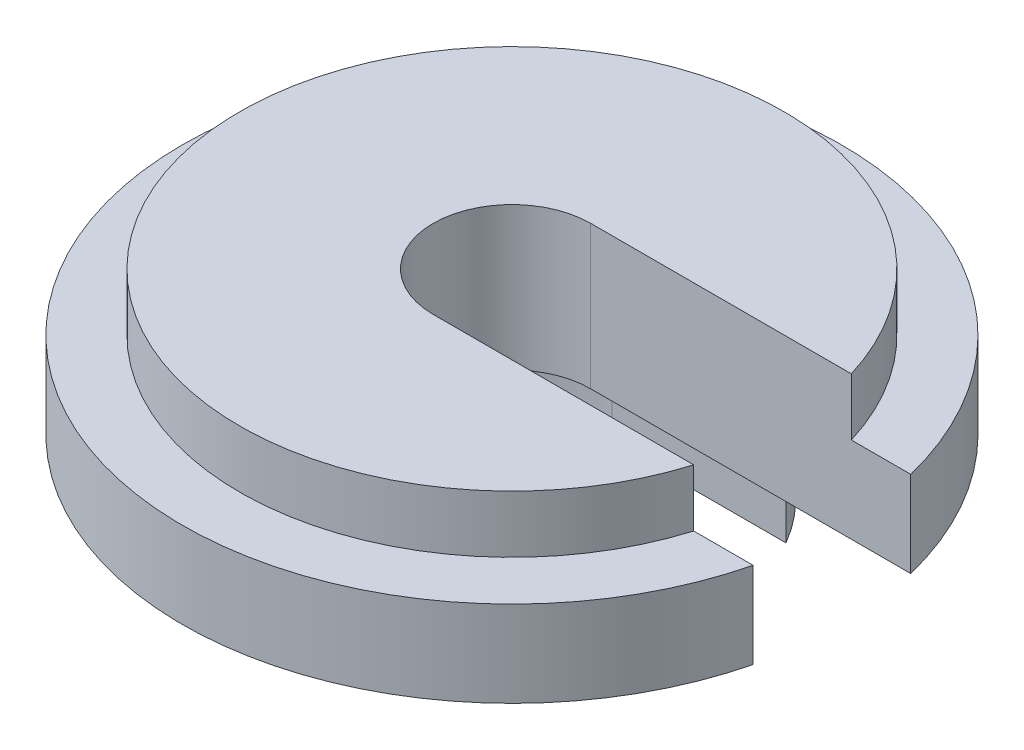
ISO-10303-21;
HEADER;
FILE_DESCRIPTION(('STEP AP214'),'2;1');
FILE_NAME('part.step','',(''),(''),'','','');
FILE_SCHEMA(('AUTOMOTIVE_DESIGN { 1 0 10303 214 1 1 1 1 }'));
ENDSEC;
DATA;
#1=APPLICATION_CONTEXT('core data for automotive mechanical design processes');
#2=APPLICATION_PROTOCOL_DEFINITION('international standard','automotive_design',2000,#1);
#3=PRODUCT_CONTEXT('',#1,'mechanical');
#4=PRODUCT('Part','Part','',(#3));
#5=PRODUCT_RELATED_PRODUCT_CATEGORY('part','',(#4));
#6=PRODUCT_DEFINITION_FORMATION('','',#4);
#7=PRODUCT_DEFINITION_CONTEXT('part definition',#1,'design');
#8=PRODUCT_DEFINITION('design','',#6,#7);
#9=PRODUCT_DEFINITION_SHAPE('','',#8);
#10=(LENGTH_UNIT() NAMED_UNIT(*) SI_UNIT(.MILLI.,.METRE.));
#11=(NAMED_UNIT(*) PLANE_ANGLE_UNIT() SI_UNIT($,.RADIAN.));
#12=(NAMED_UNIT(*) SI_UNIT($,.STERADIAN.) SOLID_ANGLE_UNIT());
#13=UNCERTAINTY_MEASURE_WITH_UNIT(LENGTH_MEASURE(1.E-05),#10,'distance_accuracy_value','');
#14=(GEOMETRIC_REPRESENTATION_CONTEXT(3) GLOBAL_UNCERTAINTY_ASSIGNED_CONTEXT((#13)) GLOBAL_UNIT_ASSIGNED_CONTEXT((#10,
#11,#12)) REPRESENTATION_CONTEXT('',''));
#15=CARTESIAN_POINT('',(0.,0.,0.));
#16=DIRECTION('',(0.,0.,1.));
#17=DIRECTION('',(1.,0.,0.));
#18=AXIS2_PLACEMENT_3D('',#15,#16,#17);
#19=CARTESIAN_POINT('',(0.,0.,0.));
#20=DIRECTION('',(0.,1.,0.));
#21=DIRECTION('',(0.,0.,1.));
#22=AXIS2_PLACEMENT_3D('',#19,#20,#21);
#23=PLANE('',#22);
#24=CARTESIAN_POINT('',(0.,0.,0.));
#25=DIRECTION('',(0.,-1.,0.));
#26=DIRECTION('',(0.,0.,-1.));
#27=AXIS2_PLACEMENT_3D('',#24,#25,#26);
#28=CIRCLE('',#27,3.5);
#29=CARTESIAN_POINT('',(0.,0.,3.5));
#30=VERTEX_POINT('',#29);
#31=CARTESIAN_POINT('',(0.,0.,-3.5));
#32=VERTEX_POINT('',#31);
#33=EDGE_CURVE('E173',#30,#32,#28,.T.);
#34=ORIENTED_EDGE('',*,*,#33,.F.);
#35=DIRECTION('',(-1.,0.,0.));
#36=VECTOR('',#35,1.);
#37=CARTESIAN_POINT('',(0.,0.,3.5));
#38=LINE('',#37,#36);
#39=CARTESIAN_POINT('',(6.06217782649107,0.,3.5));
#40=VERTEX_POINT('',#39);
#41=EDGE_CURVE('E177',#40,#30,#38,.T.);
#42=ORIENTED_EDGE('',*,*,#41,.F.);
#43=CARTESIAN_POINT('',(0.,0.,0.));
#44=DIRECTION('',(0.,1.,0.));
#45=DIRECTION('',(0.,0.,1.));
#46=AXIS2_PLACEMENT_3D('',#43,#44,#45);
#47=CIRCLE('',#46,7.);
#48=CARTESIAN_POINT('',(6.06217782649107,0.,-3.5));
#49=VERTEX_POINT('',#48);
#50=EDGE_CURVE('E47',#49,#40,#47,.T.);
#51=ORIENTED_EDGE('',*,*,#50,.F.);
#52=DIRECTION('',(1.,0.,0.));
#53=VECTOR('',#52,1.);
#54=CARTESIAN_POINT('',(0.,0.,-3.5));
#55=LINE('',#54,#53);
#56=EDGE_CURVE('E188',#32,#49,#55,.T.);
#57=ORIENTED_EDGE('',*,*,#56,.F.);
#58=EDGE_LOOP('',(#34,#42,#51,#57));
#59=FACE_BOUND('',#58,.T.);
#60=ADVANCED_FACE('F39',(#59),#23,.F.);
#61=CARTESIAN_POINT('',(0.,7.,0.));
#62=DIRECTION('',(0.,1.,0.));
#63=DIRECTION('',(0.,0.,1.));
#64=AXIS2_PLACEMENT_3D('',#61,#62,#63);
#65=CYLINDRICAL_SURFACE('',#64,7.);
#66=ORIENTED_EDGE('',*,*,#50,.T.);
#67=DIRECTION('',(0.,-1.,0.));
#68=VECTOR('',#67,1.);
#69=CARTESIAN_POINT('',(6.06217782649107,2.,3.5));
#70=LINE('',#69,#68);
#71=CARTESIAN_POINT('',(6.06217782649107,2.,3.5));
#72=VERTEX_POINT('',#71);
#73=EDGE_CURVE('E198',#72,#40,#70,.T.);
#74=ORIENTED_EDGE('',*,*,#73,.F.);
#75=CARTESIAN_POINT('',(0.,2.,0.));
#76=DIRECTION('',(0.,1.,0.));
#77=DIRECTION('',(0.,0.,1.));
#78=AXIS2_PLACEMENT_3D('',#75,#76,#77);
#79=CIRCLE('',#78,7.);
#80=CARTESIAN_POINT('',(6.06217782649107,2.,-3.5));
#81=VERTEX_POINT('',#80);
#82=EDGE_CURVE('E221',#81,#72,#79,.T.);
#83=ORIENTED_EDGE('',*,*,#82,.F.);
#84=DIRECTION('',(0.,-1.,0.));
#85=VECTOR('',#84,1.);
#86=CARTESIAN_POINT('',(6.06217782649107,2.,-3.5));
#87=LINE('',#86,#85);
#88=EDGE_CURVE('E201',#81,#49,#87,.T.);
#89=ORIENTED_EDGE('',*,*,#88,.T.);
#90=EDGE_LOOP('',(#66,#74,#83,#89));
#91=FACE_BOUND('',#90,.T.);
#92=ADVANCED_FACE('F228',(#91),#65,.T.);
#93=CARTESIAN_POINT('',(7.,2.,0.));
#94=DIRECTION('',(0.,1.,0.));
#95=DIRECTION('',(0.,0.,1.));
#96=AXIS2_PLACEMENT_3D('',#93,#94,#95);
#97=PLANE('',#96);
#98=CARTESIAN_POINT('',(0.,2.,0.));
#99=DIRECTION('',(0.,1.,0.));
#100=DIRECTION('',(0.,0.,1.));
#101=AXIS2_PLACEMENT_3D('',#98,#99,#100);
#102=CIRCLE('',#101,11.5);
#103=CARTESIAN_POINT('',(11.1663557170636,2.,-2.75));
#104=VERTEX_POINT('',#103);
#105=CARTESIAN_POINT('',(11.1663557170636,2.,2.75));
#106=VERTEX_POINT('',#105);
#107=EDGE_CURVE('E217',#104,#106,#102,.T.);
#108=ORIENTED_EDGE('',*,*,#107,.F.);
#109=DIRECTION('',(-1.,0.,0.));
#110=VECTOR('',#109,1.);
#111=CARTESIAN_POINT('',(7.,2.,-2.75));
#112=LINE('',#111,#110);
#113=CARTESIAN_POINT('',(0.,2.,-2.75));
#114=VERTEX_POINT('',#113);
#115=EDGE_CURVE('E168',#104,#114,#112,.T.);
#116=ORIENTED_EDGE('',*,*,#115,.T.);
#117=CARTESIAN_POINT('',(0.,2.,0.));
#118=DIRECTION('',(0.,1.,0.));
#119=DIRECTION('',(0.,0.,1.));
#120=AXIS2_PLACEMENT_3D('',#117,#118,#119);
#121=CIRCLE('',#120,2.75);
#122=CARTESIAN_POINT('',(0.,2.,2.75));
#123=VERTEX_POINT('',#122);
#124=EDGE_CURVE('E121',#114,#123,#121,.T.);
#125=ORIENTED_EDGE('',*,*,#124,.T.);
#126=DIRECTION('',(1.,0.,0.));
#127=VECTOR('',#126,1.);
#128=CARTESIAN_POINT('',(7.,2.,2.75));
#129=LINE('',#128,#127);
#130=EDGE_CURVE('E158',#123,#106,#129,.T.);
#131=ORIENTED_EDGE('',*,*,#130,.T.);
#132=EDGE_LOOP('',(#108,#116,#125,#131));
#133=FACE_BOUND('',#132,.T.);
#134=ORIENTED_EDGE('',*,*,#82,.T.);
#135=DIRECTION('',(-1.,0.,0.));
#136=VECTOR('',#135,1.);
#137=CARTESIAN_POINT('',(0.,2.,3.5));
#138=LINE('',#137,#136);
#139=CARTESIAN_POINT('',(0.,2.,3.5));
#140=VERTEX_POINT('',#139);
#141=EDGE_CURVE('E180',#72,#140,#138,.T.);
#142=ORIENTED_EDGE('',*,*,#141,.T.);
#143=CARTESIAN_POINT('',(0.,2.,0.));
#144=DIRECTION('',(0.,-1.,0.));
#145=DIRECTION('',(0.,0.,-1.));
#146=AXIS2_PLACEMENT_3D('',#143,#144,#145);
#147=CIRCLE('',#146,3.5);
#148=CARTESIAN_POINT('',(0.,2.,-3.5));
#149=VERTEX_POINT('',#148);
#150=EDGE_CURVE('E174',#140,#149,#147,.T.);
#151=ORIENTED_EDGE('',*,*,#150,.T.);
#152=DIRECTION('',(1.,0.,0.));
#153=VECTOR('',#152,1.);
#154=CARTESIAN_POINT('',(0.,2.,-3.5));
#155=LINE('',#154,#153);
#156=EDGE_CURVE('E62',#149,#81,#155,.T.);
#157=ORIENTED_EDGE('',*,*,#156,.T.);
#158=EDGE_LOOP('',(#134,#142,#151,#157));
#159=FACE_BOUND('',#158,.T.);
#160=ADVANCED_FACE('F237',(#133,#159),#97,.F.);
#161=CARTESIAN_POINT('',(0.,7.,0.));
#162=DIRECTION('',(0.,1.,0.));
#163=DIRECTION('',(0.,0.,1.));
#164=AXIS2_PLACEMENT_3D('',#161,#162,#163);
#165=CYLINDRICAL_SURFACE('',#164,11.5);
#166=CARTESIAN_POINT('',(0.,5.,0.));
#167=DIRECTION('',(0.,1.,0.));
#168=DIRECTION('',(0.,0.,1.));
#169=AXIS2_PLACEMENT_3D('',#166,#167,#168);
#170=CIRCLE('',#169,11.5);
#171=CARTESIAN_POINT('',(11.1663557170636,5.,-2.75));
#172=VERTEX_POINT('',#171);
#173=CARTESIAN_POINT('',(11.1663557170636,5.,2.75));
#174=VERTEX_POINT('',#173);
#175=EDGE_CURVE('E213',#172,#174,#170,.T.);
#176=ORIENTED_EDGE('',*,*,#175,.F.);
#177=DIRECTION('',(0.,1.,0.));
#178=VECTOR('',#177,1.);
#179=CARTESIAN_POINT('',(11.1663557170636,-4.,-2.75));
#180=LINE('',#179,#178);
#181=EDGE_CURVE('E126',#104,#172,#180,.T.);
#182=ORIENTED_EDGE('',*,*,#181,.F.);
#183=ORIENTED_EDGE('',*,*,#107,.T.);
#184=DIRECTION('',(0.,1.,0.));
#185=VECTOR('',#184,1.);
#186=CARTESIAN_POINT('',(11.1663557170636,-4.,2.75));
#187=LINE('',#186,#185);
#188=EDGE_CURVE('E145',#106,#174,#187,.T.);
#189=ORIENTED_EDGE('',*,*,#188,.T.);
#190=EDGE_LOOP('',(#176,#182,#183,#189));
#191=FACE_BOUND('',#190,.T.);
#192=ADVANCED_FACE('F258',(#191),#165,.T.);
#193=CARTESIAN_POINT('',(11.5,5.,0.));
#194=DIRECTION('',(0.,-1.,0.));
#195=DIRECTION('',(0.,0.,-1.));
#196=AXIS2_PLACEMENT_3D('',#193,#194,#195);
#197=PLANE('',#196);
#198=CARTESIAN_POINT('',(0.,5.,0.));
#199=DIRECTION('',(0.,1.,0.));
#200=DIRECTION('',(0.,0.,1.));
#201=AXIS2_PLACEMENT_3D('',#198,#199,#200);
#202=CIRCLE('',#201,9.5);
#203=CARTESIAN_POINT('',(9.09326673973661,5.,-2.75));
#204=VERTEX_POINT('',#203);
#205=CARTESIAN_POINT('',(9.09326673973661,5.,2.75));
#206=VERTEX_POINT('',#205);
#207=EDGE_CURVE('E209',#204,#206,#202,.T.);
#208=ORIENTED_EDGE('',*,*,#207,.F.);
#209=DIRECTION('',(1.,0.,0.));
#210=VECTOR('',#209,1.);
#211=CARTESIAN_POINT('',(11.5,5.,-2.75));
#212=LINE('',#211,#210);
#213=EDGE_CURVE('E164',#204,#172,#212,.T.);
#214=ORIENTED_EDGE('',*,*,#213,.T.);
#215=ORIENTED_EDGE('',*,*,#175,.T.);
#216=DIRECTION('',(-1.,0.,0.));
#217=VECTOR('',#216,1.);
#218=CARTESIAN_POINT('',(11.5,5.,2.75));
#219=LINE('',#218,#217);
#220=EDGE_CURVE('E154',#174,#206,#219,.T.);
#221=ORIENTED_EDGE('',*,*,#220,.T.);
#222=EDGE_LOOP('',(#208,#214,#215,#221));
#223=FACE_BOUND('',#222,.T.);
#224=ADVANCED_FACE('F264',(#223),#197,.F.);
#225=CARTESIAN_POINT('',(0.,7.,0.));
#226=DIRECTION('',(0.,1.,0.));
#227=DIRECTION('',(0.,0.,1.));
#228=AXIS2_PLACEMENT_3D('',#225,#226,#227);
#229=CYLINDRICAL_SURFACE('',#228,9.5);
#230=CARTESIAN_POINT('',(0.,7.,0.));
#231=DIRECTION('',(0.,1.,0.));
#232=DIRECTION('',(0.,0.,1.));
#233=AXIS2_PLACEMENT_3D('',#230,#231,#232);
#234=CIRCLE('',#233,9.5);
#235=CARTESIAN_POINT('',(9.0932667397366,7.,-2.75));
#236=VERTEX_POINT('',#235);
#237=CARTESIAN_POINT('',(9.0932667397366,7.,2.75));
#238=VERTEX_POINT('',#237);
#239=EDGE_CURVE('E197',#236,#238,#234,.T.);
#240=ORIENTED_EDGE('',*,*,#239,.F.);
#241=DIRECTION('',(0.,1.,0.));
#242=VECTOR('',#241,1.);
#243=CARTESIAN_POINT('',(9.09326673973661,7.,-2.75));
#244=LINE('',#243,#242);
#245=EDGE_CURVE('E130',#236,#204,#244,.F.);
#246=ORIENTED_EDGE('',*,*,#245,.T.);
#247=ORIENTED_EDGE('',*,*,#207,.T.);
#248=DIRECTION('',(0.,1.,0.));
#249=VECTOR('',#248,1.);
#250=CARTESIAN_POINT('',(9.09326673973661,7.,2.75));
#251=LINE('',#250,#249);
#252=EDGE_CURVE('E125',#206,#238,#251,.T.);
#253=ORIENTED_EDGE('',*,*,#252,.T.);
#254=EDGE_LOOP('',(#240,#246,#247,#253));
#255=FACE_BOUND('',#254,.T.);
#256=ADVANCED_FACE('F268',(#255),#229,.T.);
#257=CARTESIAN_POINT('',(9.5,7.,0.));
#258=DIRECTION('',(0.,-1.,0.));
#259=DIRECTION('',(0.,0.,-1.));
#260=AXIS2_PLACEMENT_3D('',#257,#258,#259);
#261=PLANE('',#260);
#262=CARTESIAN_POINT('',(0.,7.,0.));
#263=DIRECTION('',(0.,1.,0.));
#264=DIRECTION('',(0.,0.,1.));
#265=AXIS2_PLACEMENT_3D('',#262,#263,#264);
#266=CIRCLE('',#265,2.75);
#267=CARTESIAN_POINT('',(0.,7.,-2.75));
#268=VERTEX_POINT('',#267);
#269=CARTESIAN_POINT('',(0.,7.,2.75));
#270=VERTEX_POINT('',#269);
#271=EDGE_CURVE('E54',#268,#270,#266,.T.);
#272=ORIENTED_EDGE('',*,*,#271,.F.);
#273=DIRECTION('',(1.,0.,0.));
#274=VECTOR('',#273,1.);
#275=CARTESIAN_POINT('',(9.5,7.,-2.75));
#276=LINE('',#275,#274);
#277=EDGE_CURVE('E11',#268,#236,#276,.T.);
#278=ORIENTED_EDGE('',*,*,#277,.T.);
#279=ORIENTED_EDGE('',*,*,#239,.T.);
#280=DIRECTION('',(1.,0.,0.));
#281=VECTOR('',#280,1.);
#282=CARTESIAN_POINT('',(0.,7.,2.75));
#283=LINE('',#282,#281);
#284=EDGE_CURVE('E136',#270,#238,#283,.T.);
#285=ORIENTED_EDGE('',*,*,#284,.F.);
#286=EDGE_LOOP('',(#272,#278,#279,#285));
#287=FACE_BOUND('',#286,.T.);
#288=ADVANCED_FACE('F135',(#287),#261,.F.);
#289=CARTESIAN_POINT('',(0.,2.,0.));
#290=DIRECTION('',(0.,-1.,0.));
#291=DIRECTION('',(0.,0.,-1.));
#292=AXIS2_PLACEMENT_3D('',#289,#290,#291);
#293=CYLINDRICAL_SURFACE('',#292,3.5);
#294=ORIENTED_EDGE('',*,*,#33,.T.);
#295=DIRECTION('',(0.,-1.,0.));
#296=VECTOR('',#295,1.);
#297=CARTESIAN_POINT('',(0.,2.,-3.5));
#298=LINE('',#297,#296);
#299=EDGE_CURVE('E184',#149,#32,#298,.T.);
#300=ORIENTED_EDGE('',*,*,#299,.F.);
#301=ORIENTED_EDGE('',*,*,#150,.F.);
#302=DIRECTION('',(0.,-1.,0.));
#303=VECTOR('',#302,1.);
#304=CARTESIAN_POINT('',(0.,2.,3.5));
#305=LINE('',#304,#303);
#306=EDGE_CURVE('E194',#140,#30,#305,.T.);
#307=ORIENTED_EDGE('',*,*,#306,.T.);
#308=EDGE_LOOP('',(#294,#300,#301,#307));
#309=FACE_BOUND('',#308,.T.);
#310=ADVANCED_FACE('F239',(#309),#293,.F.);
#311=CARTESIAN_POINT('',(0.,2.,3.5));
#312=DIRECTION('',(0.,0.,1.));
#313=DIRECTION('',(1.,0.,0.));
#314=AXIS2_PLACEMENT_3D('',#311,#312,#313);
#315=PLANE('',#314);
#316=ORIENTED_EDGE('',*,*,#41,.T.);
#317=ORIENTED_EDGE('',*,*,#306,.F.);
#318=ORIENTED_EDGE('',*,*,#141,.F.);
#319=ORIENTED_EDGE('',*,*,#73,.T.);
#320=EDGE_LOOP('',(#316,#317,#318,#319));
#321=FACE_BOUND('',#320,.T.);
#322=ADVANCED_FACE('F235',(#321),#315,.F.);
#323=CARTESIAN_POINT('',(0.,2.,-3.5));
#324=DIRECTION('',(0.,0.,-1.));
#325=DIRECTION('',(-1.,0.,0.));
#326=AXIS2_PLACEMENT_3D('',#323,#324,#325);
#327=PLANE('',#326);
#328=ORIENTED_EDGE('',*,*,#56,.T.);
#329=ORIENTED_EDGE('',*,*,#88,.F.);
#330=ORIENTED_EDGE('',*,*,#156,.F.);
#331=ORIENTED_EDGE('',*,*,#299,.T.);
#332=EDGE_LOOP('',(#328,#329,#330,#331));
#333=FACE_BOUND('',#332,.T.);
#334=ADVANCED_FACE('F241',(#333),#327,.F.);
#335=CARTESIAN_POINT('',(0.,-4.,0.));
#336=DIRECTION('',(0.,1.,0.));
#337=DIRECTION('',(0.,0.,1.));
#338=AXIS2_PLACEMENT_3D('',#335,#336,#337);
#339=CYLINDRICAL_SURFACE('',#338,2.75);
#340=DIRECTION('',(0.,1.,0.));
#341=VECTOR('',#340,1.);
#342=CARTESIAN_POINT('',(0.,-4.,-2.75));
#343=LINE('',#342,#341);
#344=EDGE_CURVE('E117',#114,#268,#343,.T.);
#345=ORIENTED_EDGE('',*,*,#344,.T.);
#346=ORIENTED_EDGE('',*,*,#271,.T.);
#347=DIRECTION('',(0.,1.,0.));
#348=VECTOR('',#347,1.);
#349=CARTESIAN_POINT('',(0.,-4.,2.75));
#350=LINE('',#349,#348);
#351=EDGE_CURVE('E140',#123,#270,#350,.T.);
#352=ORIENTED_EDGE('',*,*,#351,.F.);
#353=ORIENTED_EDGE('',*,*,#124,.F.);
#354=EDGE_LOOP('',(#345,#346,#352,#353));
#355=FACE_BOUND('',#354,.T.);
#356=ADVANCED_FACE('F119',(#355),#339,.F.);
#357=CARTESIAN_POINT('',(0.,-4.,-2.75));
#358=DIRECTION('',(0.,0.,-1.));
#359=DIRECTION('',(-1.,0.,0.));
#360=AXIS2_PLACEMENT_3D('',#357,#358,#359);
#361=PLANE('',#360);
#362=ORIENTED_EDGE('',*,*,#181,.T.);
#363=ORIENTED_EDGE('',*,*,#213,.F.);
#364=ORIENTED_EDGE('',*,*,#245,.F.);
#365=ORIENTED_EDGE('',*,*,#277,.F.);
#366=ORIENTED_EDGE('',*,*,#344,.F.);
#367=ORIENTED_EDGE('',*,*,#115,.F.);
#368=EDGE_LOOP('',(#362,#363,#364,#365,#366,#367));
#369=FACE_BOUND('',#368,.T.);
#370=ADVANCED_FACE('F128',(#369),#361,.F.);
#371=CARTESIAN_POINT('',(0.,-4.,2.75));
#372=DIRECTION('',(0.,0.,1.));
#373=DIRECTION('',(1.,0.,0.));
#374=AXIS2_PLACEMENT_3D('',#371,#372,#373);
#375=PLANE('',#374);
#376=ORIENTED_EDGE('',*,*,#351,.T.);
#377=ORIENTED_EDGE('',*,*,#284,.T.);
#378=ORIENTED_EDGE('',*,*,#252,.F.);
#379=ORIENTED_EDGE('',*,*,#220,.F.);
#380=ORIENTED_EDGE('',*,*,#188,.F.);
#381=ORIENTED_EDGE('',*,*,#130,.F.);
#382=EDGE_LOOP('',(#376,#377,#378,#379,#380,#381));
#383=FACE_BOUND('',#382,.T.);
#384=ADVANCED_FACE('F331',(#383),#375,.F.);
#385=CLOSED_SHELL('',(#60,#92,#160,#192,#224,#256,#288,#310,#322,#334,#356,#370,#384));
#386=MANIFOLD_SOLID_BREP('B2',#385);
#387=ADVANCED_BREP_SHAPE_REPRESENTATION('',(#18,#386),#14);
#388=SHAPE_DEFINITION_REPRESENTATION(#9,#387);
ENDSEC;
END-ISO-10303-21;
